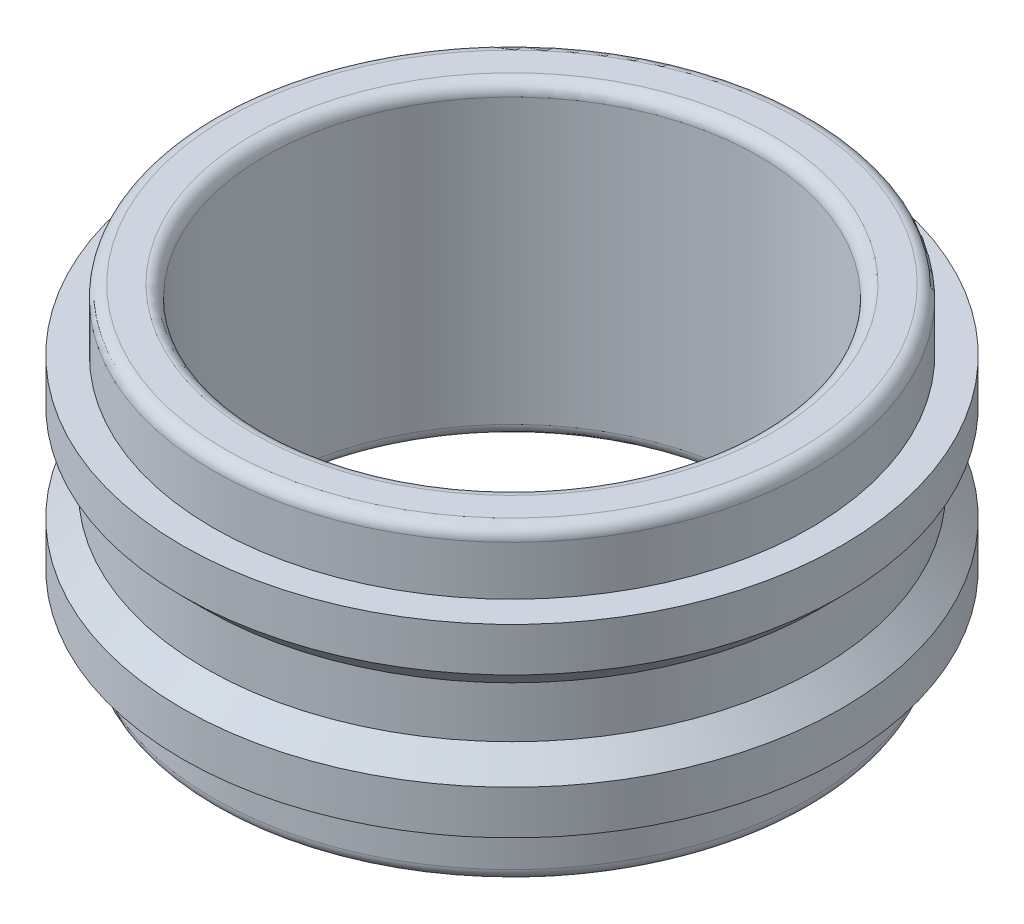
ISO-10303-21;
HEADER;
FILE_DESCRIPTION(('STEP AP214'),'2;1');
FILE_NAME('part.step','',(''),(''),'','','');
FILE_SCHEMA(('AUTOMOTIVE_DESIGN { 1 0 10303 214 1 1 1 1 }'));
ENDSEC;
DATA;
#1=APPLICATION_CONTEXT('core data for automotive mechanical design processes');
#2=APPLICATION_PROTOCOL_DEFINITION('international standard','automotive_design',2000,#1);
#3=PRODUCT_CONTEXT('',#1,'mechanical');
#4=PRODUCT('Part','Part','',(#3));
#5=PRODUCT_RELATED_PRODUCT_CATEGORY('part','',(#4));
#6=PRODUCT_DEFINITION_FORMATION('','',#4);
#7=PRODUCT_DEFINITION_CONTEXT('part definition',#1,'design');
#8=PRODUCT_DEFINITION('design','',#6,#7);
#9=PRODUCT_DEFINITION_SHAPE('','',#8);
#10=(LENGTH_UNIT() NAMED_UNIT(*) SI_UNIT(.MILLI.,.METRE.));
#11=(NAMED_UNIT(*) PLANE_ANGLE_UNIT() SI_UNIT($,.RADIAN.));
#12=(NAMED_UNIT(*) SI_UNIT($,.STERADIAN.) SOLID_ANGLE_UNIT());
#13=UNCERTAINTY_MEASURE_WITH_UNIT(LENGTH_MEASURE(1.E-05),#10,'distance_accuracy_value','');
#14=(GEOMETRIC_REPRESENTATION_CONTEXT(3) GLOBAL_UNCERTAINTY_ASSIGNED_CONTEXT((#13)) GLOBAL_UNIT_ASSIGNED_CONTEXT((#10,
#11,#12)) REPRESENTATION_CONTEXT('',''));
#15=CARTESIAN_POINT('',(0.,0.,0.));
#16=DIRECTION('',(0.,0.,1.));
#17=DIRECTION('',(1.,0.,0.));
#18=AXIS2_PLACEMENT_3D('',#15,#16,#17);
#19=CARTESIAN_POINT('',(0.,5.,0.));
#20=DIRECTION('',(0.,-1.,0.));
#21=DIRECTION('',(0.,0.,-1.));
#22=AXIS2_PLACEMENT_3D('',#19,#20,#21);
#23=CYLINDRICAL_SURFACE('',#22,5.35);
#24=CARTESIAN_POINT('',(0.,1.,0.));
#25=DIRECTION('',(0.,1.,0.));
#26=DIRECTION('',(0.,0.,1.));
#27=AXIS2_PLACEMENT_3D('',#24,#25,#26);
#28=CIRCLE('',#27,5.35);
#29=CARTESIAN_POINT('',(0.,1.,5.35));
#30=VERTEX_POINT('',#29);
#31=EDGE_CURVE('E77',#30,#30,#28,.T.);
#32=ORIENTED_EDGE('',*,*,#31,.T.);
#33=EDGE_LOOP('',(#32));
#34=FACE_BOUND('',#33,.T.);
#35=CARTESIAN_POINT('',(0.,1.7107864376269,0.));
#36=DIRECTION('',(0.,-1.,0.));
#37=DIRECTION('',(0.,0.,-1.));
#38=AXIS2_PLACEMENT_3D('',#35,#36,#37);
#39=CIRCLE('',#38,5.35);
#40=CARTESIAN_POINT('',(0.,1.7107864376269,-5.35));
#41=VERTEX_POINT('',#40);
#42=EDGE_CURVE('E64',#41,#41,#39,.F.);
#43=ORIENTED_EDGE('',*,*,#42,.F.);
#44=EDGE_LOOP('',(#43));
#45=FACE_BOUND('',#44,.T.);
#46=ADVANCED_FACE('F31',(#34,#45),#23,.T.);
#47=CARTESIAN_POINT('',(0.,4.,0.));
#48=DIRECTION('',(0.,1.,0.));
#49=DIRECTION('',(0.,0.,1.));
#50=AXIS2_PLACEMENT_3D('',#47,#48,#49);
#51=CIRCLE('',#50,5.35);
#52=CARTESIAN_POINT('',(0.,4.,5.35));
#53=VERTEX_POINT('',#52);
#54=EDGE_CURVE('E63',#53,#53,#51,.T.);
#55=ORIENTED_EDGE('',*,*,#54,.F.);
#56=EDGE_LOOP('',(#55));
#57=FACE_BOUND('',#56,.T.);
#58=CARTESIAN_POINT('',(0.,3.28921356237309,0.));
#59=DIRECTION('',(0.,1.,0.));
#60=DIRECTION('',(0.,0.,1.));
#61=AXIS2_PLACEMENT_3D('',#58,#59,#60);
#62=CIRCLE('',#61,5.35);
#63=CARTESIAN_POINT('',(0.,3.28921356237309,5.35));
#64=VERTEX_POINT('',#63);
#65=EDGE_CURVE('E68',#64,#64,#62,.F.);
#66=ORIENTED_EDGE('',*,*,#65,.F.);
#67=EDGE_LOOP('',(#66));
#68=FACE_BOUND('',#67,.T.);
#69=ADVANCED_FACE('F98',(#57,#68),#23,.T.);
#70=CARTESIAN_POINT('',(0.,0.,0.));
#71=DIRECTION('',(0.,1.,0.));
#72=DIRECTION('',(0.,0.,1.));
#73=AXIS2_PLACEMENT_3D('',#70,#71,#72);
#74=PLANE('',#73);
#75=CARTESIAN_POINT('',(0.,0.,0.));
#76=DIRECTION('',(0.,1.,0.));
#77=DIRECTION('',(0.,0.,1.));
#78=AXIS2_PLACEMENT_3D('',#75,#76,#77);
#79=CIRCLE('',#78,4.2);
#80=CARTESIAN_POINT('',(0.,0.,4.2));
#81=VERTEX_POINT('',#80);
#82=EDGE_CURVE('E57',#81,#81,#79,.T.);
#83=ORIENTED_EDGE('',*,*,#82,.T.);
#84=EDGE_LOOP('',(#83));
#85=FACE_BOUND('',#84,.T.);
#86=CARTESIAN_POINT('',(0.,0.,0.));
#87=DIRECTION('',(0.,1.,0.));
#88=DIRECTION('',(0.,0.,1.));
#89=AXIS2_PLACEMENT_3D('',#86,#87,#88);
#90=CIRCLE('',#89,4.65);
#91=CARTESIAN_POINT('',(0.,0.,4.65));
#92=VERTEX_POINT('',#91);
#93=EDGE_CURVE('E60',#92,#92,#90,.F.);
#94=ORIENTED_EDGE('',*,*,#93,.T.);
#95=EDGE_LOOP('',(#94));
#96=FACE_BOUND('',#95,.T.);
#97=ADVANCED_FACE('F100',(#85,#96),#74,.F.);
#98=CARTESIAN_POINT('',(0.,5.,0.));
#99=DIRECTION('',(0.,1.,0.));
#100=DIRECTION('',(0.,0.,1.));
#101=AXIS2_PLACEMENT_3D('',#98,#99,#100);
#102=PLANE('',#101);
#103=CARTESIAN_POINT('',(0.,5.,0.));
#104=DIRECTION('',(0.,1.,0.));
#105=DIRECTION('',(0.,0.,1.));
#106=AXIS2_PLACEMENT_3D('',#103,#104,#105);
#107=CIRCLE('',#106,4.2);
#108=CARTESIAN_POINT('',(0.,5.,4.2));
#109=VERTEX_POINT('',#108);
#110=EDGE_CURVE('E38',#109,#109,#107,.F.);
#111=ORIENTED_EDGE('',*,*,#110,.T.);
#112=EDGE_LOOP('',(#111));
#113=FACE_BOUND('',#112,.T.);
#114=CARTESIAN_POINT('',(0.,5.,0.));
#115=DIRECTION('',(0.,1.,0.));
#116=DIRECTION('',(0.,0.,1.));
#117=AXIS2_PLACEMENT_3D('',#114,#115,#116);
#118=CIRCLE('',#117,4.65);
#119=CARTESIAN_POINT('',(0.,5.,4.65));
#120=VERTEX_POINT('',#119);
#121=EDGE_CURVE('E42',#120,#120,#118,.T.);
#122=ORIENTED_EDGE('',*,*,#121,.T.);
#123=EDGE_LOOP('',(#122));
#124=FACE_BOUND('',#123,.T.);
#125=ADVANCED_FACE('F107',(#113,#124),#102,.T.);
#126=CARTESIAN_POINT('',(0.,5.,0.));
#127=DIRECTION('',(0.,-1.,0.));
#128=DIRECTION('',(0.,0.,-1.));
#129=AXIS2_PLACEMENT_3D('',#126,#127,#128);
#130=CYLINDRICAL_SURFACE('',#129,4.);
#131=CARTESIAN_POINT('',(0.,0.2,0.));
#132=DIRECTION('',(0.,1.,0.));
#133=DIRECTION('',(0.,0.,1.));
#134=AXIS2_PLACEMENT_3D('',#131,#132,#133);
#135=CIRCLE('',#134,4.);
#136=CARTESIAN_POINT('',(0.,0.2,4.));
#137=VERTEX_POINT('',#136);
#138=EDGE_CURVE('E51',#137,#137,#135,.F.);
#139=ORIENTED_EDGE('',*,*,#138,.T.);
#140=EDGE_LOOP('',(#139));
#141=FACE_BOUND('',#140,.T.);
#142=CARTESIAN_POINT('',(0.,4.8,0.));
#143=DIRECTION('',(0.,1.,0.));
#144=DIRECTION('',(0.,0.,1.));
#145=AXIS2_PLACEMENT_3D('',#142,#143,#144);
#146=CIRCLE('',#145,4.);
#147=CARTESIAN_POINT('',(0.,4.8,4.));
#148=VERTEX_POINT('',#147);
#149=EDGE_CURVE('E54',#148,#148,#146,.T.);
#150=ORIENTED_EDGE('',*,*,#149,.T.);
#151=EDGE_LOOP('',(#150));
#152=FACE_BOUND('',#151,.T.);
#153=ADVANCED_FACE('F131',(#141,#152),#130,.F.);
#154=CARTESIAN_POINT('',(0.,4.,0.));
#155=DIRECTION('',(0.,1.,0.));
#156=DIRECTION('',(0.,0.,1.));
#157=AXIS2_PLACEMENT_3D('',#154,#155,#156);
#158=PLANE('',#157);
#159=CARTESIAN_POINT('',(0.,4.,0.));
#160=DIRECTION('',(0.,1.,0.));
#161=DIRECTION('',(0.,0.,1.));
#162=AXIS2_PLACEMENT_3D('',#159,#160,#161);
#163=CIRCLE('',#162,4.85);
#164=CARTESIAN_POINT('',(0.,4.,4.85));
#165=VERTEX_POINT('',#164);
#166=EDGE_CURVE('E74',#165,#165,#163,.T.);
#167=ORIENTED_EDGE('',*,*,#166,.F.);
#168=EDGE_LOOP('',(#167));
#169=FACE_BOUND('',#168,.T.);
#170=ORIENTED_EDGE('',*,*,#54,.T.);
#171=EDGE_LOOP('',(#170));
#172=FACE_BOUND('',#171,.T.);
#173=ADVANCED_FACE('F133',(#169,#172),#158,.T.);
#174=CARTESIAN_POINT('',(0.,4.,0.));
#175=DIRECTION('',(0.,1.,0.));
#176=DIRECTION('',(0.,0.,1.));
#177=AXIS2_PLACEMENT_3D('',#174,#175,#176);
#178=CYLINDRICAL_SURFACE('',#177,4.85);
#179=CARTESIAN_POINT('',(0.,4.8,0.));
#180=DIRECTION('',(0.,1.,0.));
#181=DIRECTION('',(0.,0.,1.));
#182=AXIS2_PLACEMENT_3D('',#179,#180,#181);
#183=CIRCLE('',#182,4.85);
#184=CARTESIAN_POINT('',(0.,4.8,4.85));
#185=VERTEX_POINT('',#184);
#186=EDGE_CURVE('E10',#185,#185,#183,.F.);
#187=ORIENTED_EDGE('',*,*,#186,.T.);
#188=EDGE_LOOP('',(#187));
#189=FACE_BOUND('',#188,.T.);
#190=ORIENTED_EDGE('',*,*,#166,.T.);
#191=EDGE_LOOP('',(#190));
#192=FACE_BOUND('',#191,.T.);
#193=ADVANCED_FACE('F140',(#189,#192),#178,.T.);
#194=CARTESIAN_POINT('',(0.,1.,0.));
#195=DIRECTION('',(0.,1.,0.));
#196=DIRECTION('',(0.,0.,1.));
#197=AXIS2_PLACEMENT_3D('',#194,#195,#196);
#198=PLANE('',#197);
#199=CARTESIAN_POINT('',(0.,1.,0.));
#200=DIRECTION('',(0.,1.,0.));
#201=DIRECTION('',(0.,0.,1.));
#202=AXIS2_PLACEMENT_3D('',#199,#200,#201);
#203=CIRCLE('',#202,4.85);
#204=CARTESIAN_POINT('',(0.,1.,4.85));
#205=VERTEX_POINT('',#204);
#206=EDGE_CURVE('E67',#205,#205,#203,.T.);
#207=ORIENTED_EDGE('',*,*,#206,.T.);
#208=EDGE_LOOP('',(#207));
#209=FACE_BOUND('',#208,.T.);
#210=ORIENTED_EDGE('',*,*,#31,.F.);
#211=EDGE_LOOP('',(#210));
#212=FACE_BOUND('',#211,.T.);
#213=ADVANCED_FACE('F146',(#209,#212),#198,.F.);
#214=CARTESIAN_POINT('',(0.,0.,0.));
#215=DIRECTION('',(0.,1.,0.));
#216=DIRECTION('',(0.,0.,1.));
#217=AXIS2_PLACEMENT_3D('',#214,#215,#216);
#218=CYLINDRICAL_SURFACE('',#217,4.85);
#219=CARTESIAN_POINT('',(0.,0.2,0.));
#220=DIRECTION('',(0.,1.,0.));
#221=DIRECTION('',(0.,0.,1.));
#222=AXIS2_PLACEMENT_3D('',#219,#220,#221);
#223=CIRCLE('',#222,4.85);
#224=CARTESIAN_POINT('',(0.,0.2,4.85));
#225=VERTEX_POINT('',#224);
#226=EDGE_CURVE('E46',#225,#225,#223,.T.);
#227=ORIENTED_EDGE('',*,*,#226,.T.);
#228=EDGE_LOOP('',(#227));
#229=FACE_BOUND('',#228,.T.);
#230=ORIENTED_EDGE('',*,*,#206,.F.);
#231=EDGE_LOOP('',(#230));
#232=FACE_BOUND('',#231,.T.);
#233=ADVANCED_FACE('F149',(#229,#232),#218,.T.);
#234=CARTESIAN_POINT('',(0.,1.5,0.));
#235=DIRECTION('',(0.,-1.,0.));
#236=DIRECTION('',(0.,0.,-1.));
#237=AXIS2_PLACEMENT_3D('',#234,#235,#236);
#238=CONICAL_SURFACE('',#237,5.5607864376269,0.785398163397448);
#239=CARTESIAN_POINT('',(0.,2.08578643762691,0.));
#240=DIRECTION('',(0.,-1.,0.));
#241=DIRECTION('',(0.,0.,-1.));
#242=AXIS2_PLACEMENT_3D('',#239,#240,#241);
#243=CIRCLE('',#242,4.975);
#244=CARTESIAN_POINT('',(0.,2.08578643762691,-4.975));
#245=VERTEX_POINT('',#244);
#246=EDGE_CURVE('E71',#245,#245,#243,.T.);
#247=ORIENTED_EDGE('',*,*,#246,.T.);
#248=EDGE_LOOP('',(#247));
#249=FACE_BOUND('',#248,.T.);
#250=ORIENTED_EDGE('',*,*,#42,.T.);
#251=EDGE_LOOP('',(#250));
#252=FACE_BOUND('',#251,.T.);
#253=ADVANCED_FACE('F94',(#249,#252),#238,.T.);
#254=CARTESIAN_POINT('',(0.,2.91421356237309,0.));
#255=DIRECTION('',(0.,1.,0.));
#256=DIRECTION('',(0.,0.,1.));
#257=AXIS2_PLACEMENT_3D('',#254,#255,#256);
#258=CONICAL_SURFACE('',#257,4.975,0.785398163397447);
#259=CARTESIAN_POINT('',(0.,2.91421356237309,0.));
#260=DIRECTION('',(0.,-1.,0.));
#261=DIRECTION('',(0.,0.,-1.));
#262=AXIS2_PLACEMENT_3D('',#259,#260,#261);
#263=CIRCLE('',#262,4.975);
#264=CARTESIAN_POINT('',(0.,2.91421356237309,-4.975));
#265=VERTEX_POINT('',#264);
#266=EDGE_CURVE('E84',#265,#265,#263,.T.);
#267=ORIENTED_EDGE('',*,*,#266,.F.);
#268=EDGE_LOOP('',(#267));
#269=FACE_BOUND('',#268,.T.);
#270=ORIENTED_EDGE('',*,*,#65,.T.);
#271=EDGE_LOOP('',(#270));
#272=FACE_BOUND('',#271,.T.);
#273=ADVANCED_FACE('F91',(#269,#272),#258,.T.);
#274=CARTESIAN_POINT('',(0.,0.,0.));
#275=DIRECTION('',(0.,-1.,0.));
#276=DIRECTION('',(0.,0.,-1.));
#277=AXIS2_PLACEMENT_3D('',#274,#275,#276);
#278=CYLINDRICAL_SURFACE('',#277,4.975);
#279=ORIENTED_EDGE('',*,*,#266,.T.);
#280=EDGE_LOOP('',(#279));
#281=FACE_BOUND('',#280,.T.);
#282=ORIENTED_EDGE('',*,*,#246,.F.);
#283=EDGE_LOOP('',(#282));
#284=FACE_BOUND('',#283,.T.);
#285=ADVANCED_FACE('F88',(#281,#284),#278,.T.);
#286=CARTESIAN_POINT('',(0.,0.2,0.));
#287=DIRECTION('',(0.,1.,0.));
#288=DIRECTION('',(0.,0.,1.));
#289=AXIS2_PLACEMENT_3D('',#286,#287,#288);
#290=TOROIDAL_SURFACE('',#289,4.2,0.2);
#291=ORIENTED_EDGE('',*,*,#138,.F.);
#292=EDGE_LOOP('',(#291));
#293=FACE_BOUND('',#292,.T.);
#294=ORIENTED_EDGE('',*,*,#82,.F.);
#295=EDGE_LOOP('',(#294));
#296=FACE_BOUND('',#295,.T.);
#297=ADVANCED_FACE('F114',(#293,#296),#290,.T.);
#298=CARTESIAN_POINT('',(0.,0.2,0.));
#299=DIRECTION('',(0.,1.,0.));
#300=DIRECTION('',(0.,0.,1.));
#301=AXIS2_PLACEMENT_3D('',#298,#299,#300);
#302=TOROIDAL_SURFACE('',#301,4.65,0.2);
#303=ORIENTED_EDGE('',*,*,#93,.F.);
#304=EDGE_LOOP('',(#303));
#305=FACE_BOUND('',#304,.T.);
#306=ORIENTED_EDGE('',*,*,#226,.F.);
#307=EDGE_LOOP('',(#306));
#308=FACE_BOUND('',#307,.T.);
#309=ADVANCED_FACE('F117',(#305,#308),#302,.T.);
#310=CARTESIAN_POINT('',(0.,4.8,0.));
#311=DIRECTION('',(0.,1.,0.));
#312=DIRECTION('',(0.,0.,1.));
#313=AXIS2_PLACEMENT_3D('',#310,#311,#312);
#314=TOROIDAL_SURFACE('',#313,4.2,0.2);
#315=ORIENTED_EDGE('',*,*,#110,.F.);
#316=EDGE_LOOP('',(#315));
#317=FACE_BOUND('',#316,.T.);
#318=ORIENTED_EDGE('',*,*,#149,.F.);
#319=EDGE_LOOP('',(#318));
#320=FACE_BOUND('',#319,.T.);
#321=ADVANCED_FACE('F120',(#317,#320),#314,.T.);
#322=CARTESIAN_POINT('',(0.,4.8,0.));
#323=DIRECTION('',(0.,1.,0.));
#324=DIRECTION('',(0.,0.,1.));
#325=AXIS2_PLACEMENT_3D('',#322,#323,#324);
#326=TOROIDAL_SURFACE('',#325,4.65,0.2);
#327=ORIENTED_EDGE('',*,*,#186,.F.);
#328=EDGE_LOOP('',(#327));
#329=FACE_BOUND('',#328,.T.);
#330=ORIENTED_EDGE('',*,*,#121,.F.);
#331=EDGE_LOOP('',(#330));
#332=FACE_BOUND('',#331,.T.);
#333=ADVANCED_FACE('F33',(#329,#332),#326,.T.);
#334=CLOSED_SHELL('',(#46,#69,#97,#125,#153,#173,#193,#213,#233,#253,#273,#285,#297,#309,#321,#333));
#335=MANIFOLD_SOLID_BREP('B2',#334);
#336=ADVANCED_BREP_SHAPE_REPRESENTATION('',(#18,#335),#14);
#337=SHAPE_DEFINITION_REPRESENTATION(#9,#336);
ENDSEC;
END-ISO-10303-21;
